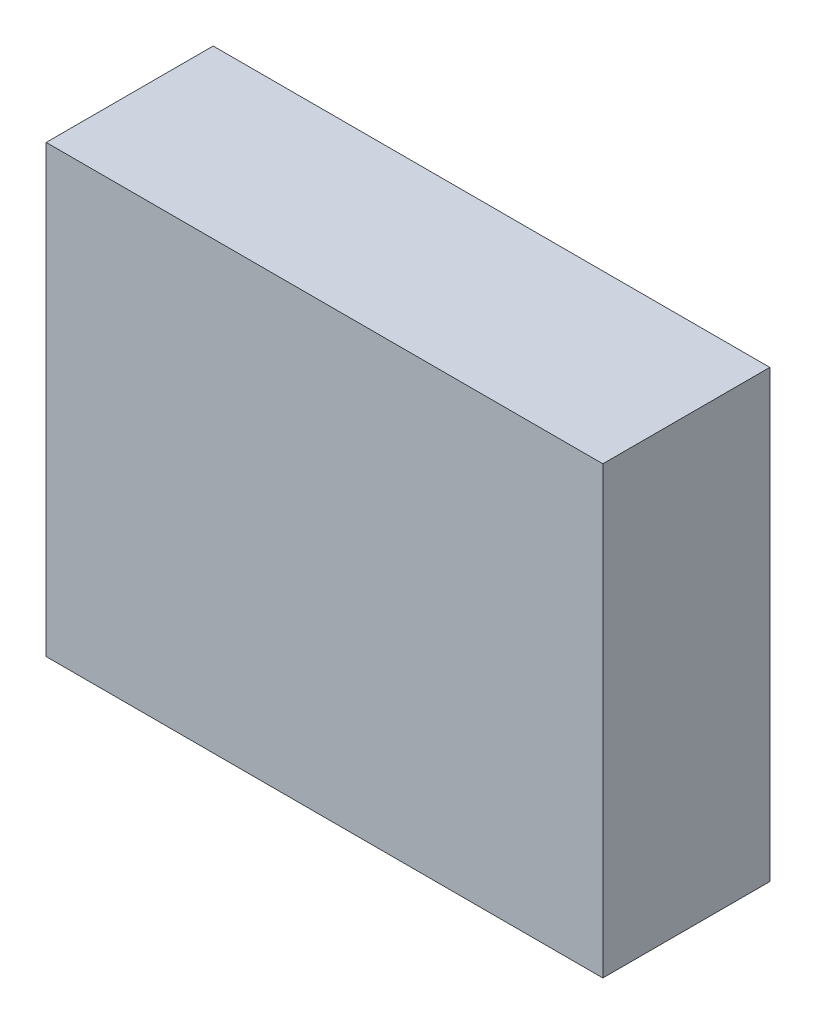
ISO-10303-21;
HEADER;
FILE_DESCRIPTION(('STEP AP214'),'2;1');
FILE_NAME('part.step','',(''),(''),'','','');
FILE_SCHEMA(('AUTOMOTIVE_DESIGN { 1 0 10303 214 1 1 1 1 }'));
ENDSEC;
DATA;
#1=APPLICATION_CONTEXT('core data for automotive mechanical design processes');
#2=APPLICATION_PROTOCOL_DEFINITION('international standard','automotive_design',2000,#1);
#3=PRODUCT_CONTEXT('',#1,'mechanical');
#4=PRODUCT('Part','Part','',(#3));
#5=PRODUCT_RELATED_PRODUCT_CATEGORY('part','',(#4));
#6=PRODUCT_DEFINITION_FORMATION('','',#4);
#7=PRODUCT_DEFINITION_CONTEXT('part definition',#1,'design');
#8=PRODUCT_DEFINITION('design','',#6,#7);
#9=PRODUCT_DEFINITION_SHAPE('','',#8);
#10=(LENGTH_UNIT() NAMED_UNIT(*) SI_UNIT(.MILLI.,.METRE.));
#11=(NAMED_UNIT(*) PLANE_ANGLE_UNIT() SI_UNIT($,.RADIAN.));
#12=(NAMED_UNIT(*) SI_UNIT($,.STERADIAN.) SOLID_ANGLE_UNIT());
#13=UNCERTAINTY_MEASURE_WITH_UNIT(LENGTH_MEASURE(1.E-05),#10,'distance_accuracy_value','');
#14=(GEOMETRIC_REPRESENTATION_CONTEXT(3) GLOBAL_UNCERTAINTY_ASSIGNED_CONTEXT((#13)) GLOBAL_UNIT_ASSIGNED_CONTEXT((#10,
#11,#12)) REPRESENTATION_CONTEXT('',''));
#15=CARTESIAN_POINT('',(0.,0.,0.));
#16=DIRECTION('',(0.,0.,1.));
#17=DIRECTION('',(1.,0.,0.));
#18=AXIS2_PLACEMENT_3D('',#15,#16,#17);
#19=CARTESIAN_POINT('',(0.,0.,0.));
#20=DIRECTION('',(-1.,0.,0.));
#21=DIRECTION('',(0.,0.,1.));
#22=AXIS2_PLACEMENT_3D('',#19,#20,#21);
#23=PLANE('',#22);
#24=DIRECTION('',(0.,0.,1.));
#25=VECTOR('',#24,1.);
#26=CARTESIAN_POINT('',(0.,0.,0.));
#27=LINE('',#26,#25);
#28=CARTESIAN_POINT('',(0.,0.,0.));
#29=VERTEX_POINT('',#28);
#30=CARTESIAN_POINT('',(0.,0.,15.));
#31=VERTEX_POINT('',#30);
#32=EDGE_CURVE('E69',#29,#31,#27,.T.);
#33=ORIENTED_EDGE('',*,*,#32,.T.);
#34=DIRECTION('',(0.,1.,0.));
#35=VECTOR('',#34,1.);
#36=CARTESIAN_POINT('',(0.,0.,15.));
#37=LINE('',#36,#35);
#38=CARTESIAN_POINT('',(0.,40.,15.));
#39=VERTEX_POINT('',#38);
#40=EDGE_CURVE('E98',#31,#39,#37,.T.);
#41=ORIENTED_EDGE('',*,*,#40,.T.);
#42=DIRECTION('',(0.,0.,1.));
#43=VECTOR('',#42,1.);
#44=CARTESIAN_POINT('',(0.,40.,0.));
#45=LINE('',#44,#43);
#46=CARTESIAN_POINT('',(0.,40.,0.));
#47=VERTEX_POINT('',#46);
#48=EDGE_CURVE('E19',#47,#39,#45,.T.);
#49=ORIENTED_EDGE('',*,*,#48,.F.);
#50=DIRECTION('',(0.,1.,0.));
#51=VECTOR('',#50,1.);
#52=CARTESIAN_POINT('',(0.,0.,0.));
#53=LINE('',#52,#51);
#54=EDGE_CURVE('E88',#29,#47,#53,.T.);
#55=ORIENTED_EDGE('',*,*,#54,.F.);
#56=EDGE_LOOP('',(#33,#41,#49,#55));
#57=FACE_BOUND('',#56,.T.);
#58=ADVANCED_FACE('F15',(#57),#23,.T.);
#59=CARTESIAN_POINT('',(50.,0.,0.));
#60=DIRECTION('',(1.,0.,0.));
#61=DIRECTION('',(0.,1.,0.));
#62=AXIS2_PLACEMENT_3D('',#59,#60,#61);
#63=PLANE('',#62);
#64=DIRECTION('',(0.,1.,0.));
#65=VECTOR('',#64,1.);
#66=CARTESIAN_POINT('',(50.,0.,0.));
#67=LINE('',#66,#65);
#68=CARTESIAN_POINT('',(50.,0.,0.));
#69=VERTEX_POINT('',#68);
#70=CARTESIAN_POINT('',(50.,40.,0.));
#71=VERTEX_POINT('',#70);
#72=EDGE_CURVE('E87',#69,#71,#67,.T.);
#73=ORIENTED_EDGE('',*,*,#72,.T.);
#74=DIRECTION('',(0.,0.,1.));
#75=VECTOR('',#74,1.);
#76=CARTESIAN_POINT('',(50.,40.,0.));
#77=LINE('',#76,#75);
#78=CARTESIAN_POINT('',(50.,40.,15.));
#79=VERTEX_POINT('',#78);
#80=EDGE_CURVE('E9',#71,#79,#77,.T.);
#81=ORIENTED_EDGE('',*,*,#80,.T.);
#82=DIRECTION('',(0.,1.,0.));
#83=VECTOR('',#82,1.);
#84=CARTESIAN_POINT('',(50.,0.,15.));
#85=LINE('',#84,#83);
#86=CARTESIAN_POINT('',(50.,0.,15.));
#87=VERTEX_POINT('',#86);
#88=EDGE_CURVE('E102',#87,#79,#85,.T.);
#89=ORIENTED_EDGE('',*,*,#88,.F.);
#90=DIRECTION('',(0.,0.,1.));
#91=VECTOR('',#90,1.);
#92=CARTESIAN_POINT('',(50.,0.,0.));
#93=LINE('',#92,#91);
#94=EDGE_CURVE('E81',#69,#87,#93,.T.);
#95=ORIENTED_EDGE('',*,*,#94,.F.);
#96=EDGE_LOOP('',(#73,#81,#89,#95));
#97=FACE_BOUND('',#96,.T.);
#98=ADVANCED_FACE('F17',(#97),#63,.T.);
#99=CARTESIAN_POINT('',(50.,40.,0.));
#100=DIRECTION('',(0.,1.,0.));
#101=DIRECTION('',(1.,0.,0.));
#102=AXIS2_PLACEMENT_3D('',#99,#100,#101);
#103=PLANE('',#102);
#104=DIRECTION('',(-1.,0.,0.));
#105=VECTOR('',#104,1.);
#106=CARTESIAN_POINT('',(50.,40.,0.));
#107=LINE('',#106,#105);
#108=EDGE_CURVE('E93',#71,#47,#107,.T.);
#109=ORIENTED_EDGE('',*,*,#108,.T.);
#110=ORIENTED_EDGE('',*,*,#48,.T.);
#111=DIRECTION('',(-1.,0.,0.));
#112=VECTOR('',#111,1.);
#113=CARTESIAN_POINT('',(50.,40.,15.));
#114=LINE('',#113,#112);
#115=EDGE_CURVE('E97',#79,#39,#114,.T.);
#116=ORIENTED_EDGE('',*,*,#115,.F.);
#117=ORIENTED_EDGE('',*,*,#80,.F.);
#118=EDGE_LOOP('',(#109,#110,#116,#117));
#119=FACE_BOUND('',#118,.T.);
#120=ADVANCED_FACE('F116',(#119),#103,.T.);
#121=CARTESIAN_POINT('',(0.,0.,0.));
#122=DIRECTION('',(0.,-1.,0.));
#123=DIRECTION('',(0.,0.,-1.));
#124=AXIS2_PLACEMENT_3D('',#121,#122,#123);
#125=PLANE('',#124);
#126=DIRECTION('',(1.,0.,0.));
#127=VECTOR('',#126,1.);
#128=CARTESIAN_POINT('',(0.,0.,0.));
#129=LINE('',#128,#127);
#130=EDGE_CURVE('E73',#29,#69,#129,.T.);
#131=ORIENTED_EDGE('',*,*,#130,.T.);
#132=ORIENTED_EDGE('',*,*,#94,.T.);
#133=DIRECTION('',(1.,0.,0.));
#134=VECTOR('',#133,1.);
#135=CARTESIAN_POINT('',(0.,0.,15.));
#136=LINE('',#135,#134);
#137=EDGE_CURVE('E76',#31,#87,#136,.T.);
#138=ORIENTED_EDGE('',*,*,#137,.F.);
#139=ORIENTED_EDGE('',*,*,#32,.F.);
#140=EDGE_LOOP('',(#131,#132,#138,#139));
#141=FACE_BOUND('',#140,.T.);
#142=ADVANCED_FACE('F71',(#141),#125,.T.);
#143=CARTESIAN_POINT('',(0.,0.,15.));
#144=DIRECTION('',(0.,0.,1.));
#145=DIRECTION('',(1.,0.,0.));
#146=AXIS2_PLACEMENT_3D('',#143,#144,#145);
#147=PLANE('',#146);
#148=ORIENTED_EDGE('',*,*,#137,.T.);
#149=ORIENTED_EDGE('',*,*,#88,.T.);
#150=ORIENTED_EDGE('',*,*,#115,.T.);
#151=ORIENTED_EDGE('',*,*,#40,.F.);
#152=EDGE_LOOP('',(#148,#149,#150,#151));
#153=FACE_BOUND('',#152,.T.);
#154=ADVANCED_FACE('F113',(#153),#147,.T.);
#155=CARTESIAN_POINT('',(0.,0.,0.));
#156=DIRECTION('',(0.,0.,-1.));
#157=DIRECTION('',(0.,-1.,0.));
#158=AXIS2_PLACEMENT_3D('',#155,#156,#157);
#159=PLANE('',#158);
#160=ORIENTED_EDGE('',*,*,#54,.T.);
#161=ORIENTED_EDGE('',*,*,#108,.F.);
#162=ORIENTED_EDGE('',*,*,#72,.F.);
#163=ORIENTED_EDGE('',*,*,#130,.F.);
#164=EDGE_LOOP('',(#160,#161,#162,#163));
#165=FACE_BOUND('',#164,.T.);
#166=ADVANCED_FACE('F82',(#165),#159,.T.);
#167=CLOSED_SHELL('',(#58,#98,#120,#142,#154,#166));
#168=MANIFOLD_SOLID_BREP('B1',#167);
#169=ADVANCED_BREP_SHAPE_REPRESENTATION('',(#18,#168),#14);
#170=SHAPE_DEFINITION_REPRESENTATION(#9,#169);
ENDSEC;
END-ISO-10303-21;
